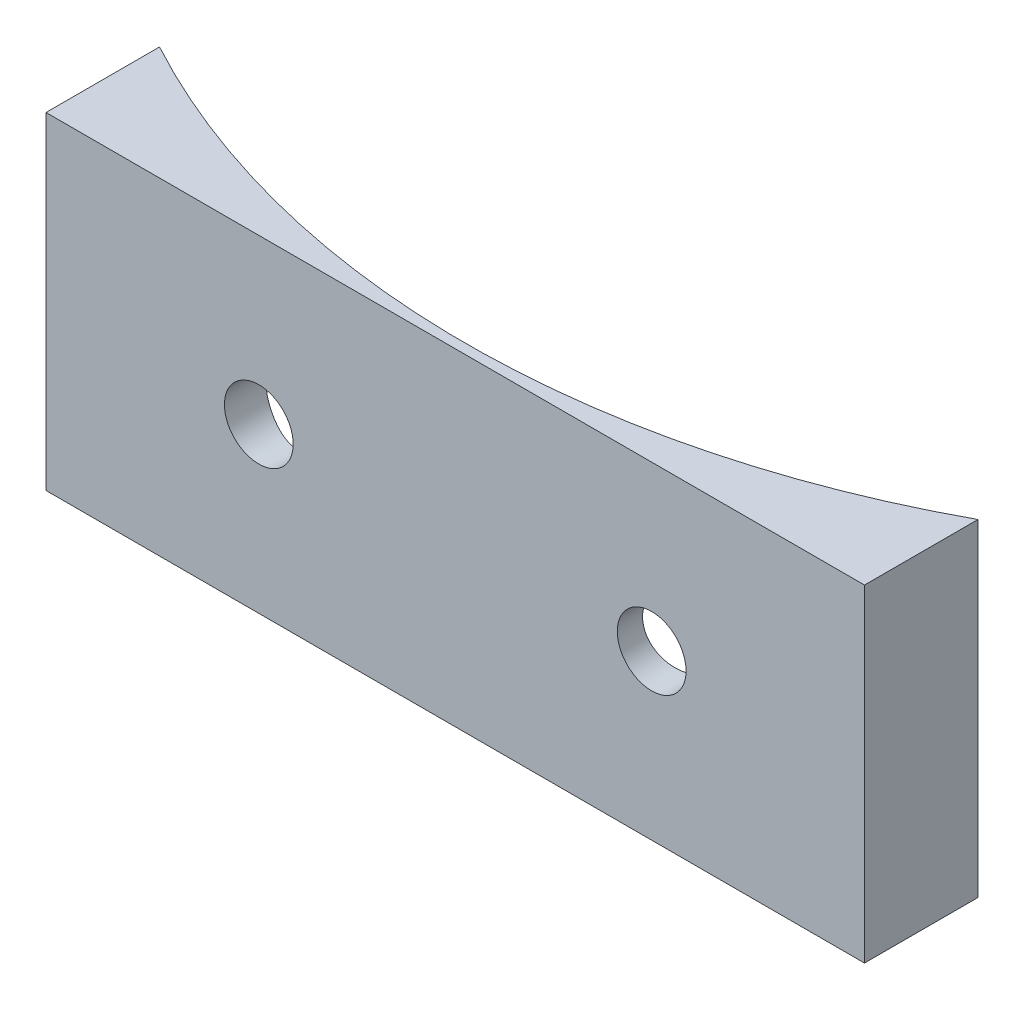
ISO-10303-21;
HEADER;
FILE_DESCRIPTION(('STEP AP214'),'2;1');
FILE_NAME('part.step','',(''),(''),'','','');
FILE_SCHEMA(('AUTOMOTIVE_DESIGN { 1 0 10303 214 1 1 1 1 }'));
ENDSEC;
DATA;
#1=APPLICATION_CONTEXT('core data for automotive mechanical design processes');
#2=APPLICATION_PROTOCOL_DEFINITION('international standard','automotive_design',2000,#1);
#3=PRODUCT_CONTEXT('',#1,'mechanical');
#4=PRODUCT('Part','Part','',(#3));
#5=PRODUCT_RELATED_PRODUCT_CATEGORY('part','',(#4));
#6=PRODUCT_DEFINITION_FORMATION('','',#4);
#7=PRODUCT_DEFINITION_CONTEXT('part definition',#1,'design');
#8=PRODUCT_DEFINITION('design','',#6,#7);
#9=PRODUCT_DEFINITION_SHAPE('','',#8);
#10=(LENGTH_UNIT() NAMED_UNIT(*) SI_UNIT(.MILLI.,.METRE.));
#11=(NAMED_UNIT(*) PLANE_ANGLE_UNIT() SI_UNIT($,.RADIAN.));
#12=(NAMED_UNIT(*) SI_UNIT($,.STERADIAN.) SOLID_ANGLE_UNIT());
#13=UNCERTAINTY_MEASURE_WITH_UNIT(LENGTH_MEASURE(1.E-05),#10,'distance_accuracy_value','');
#14=(GEOMETRIC_REPRESENTATION_CONTEXT(3) GLOBAL_UNCERTAINTY_ASSIGNED_CONTEXT((#13)) GLOBAL_UNIT_ASSIGNED_CONTEXT((#10,
#11,#12)) REPRESENTATION_CONTEXT('',''));
#15=CARTESIAN_POINT('',(0.,0.,0.));
#16=DIRECTION('',(0.,0.,1.));
#17=DIRECTION('',(1.,0.,0.));
#18=AXIS2_PLACEMENT_3D('',#15,#16,#17);
#19=CARTESIAN_POINT('',(0.,20.,0.));
#20=DIRECTION('',(0.,-1.,0.));
#21=DIRECTION('',(0.,0.,-1.));
#22=AXIS2_PLACEMENT_3D('',#19,#20,#21);
#23=CYLINDRICAL_SURFACE('',#22,52.5);
#24=CARTESIAN_POINT('',(-9.89999999999999,10.,51.558122541458));
#25=CARTESIAN_POINT('',(-9.90000537301511,10.1162955837565,51.5581218664655));
#26=CARTESIAN_POINT('',(-9.90969571298099,10.2326757477756,51.5562637349352));
#27=CARTESIAN_POINT('',(-9.94818660097837,10.4622063508252,51.5488501543209));
#28=CARTESIAN_POINT('',(-9.97701005640323,10.5753527486027,51.5432902732408));
#29=CARTESIAN_POINT('',(-10.052845805051,10.7950324296863,51.5285529924344));
#30=CARTESIAN_POINT('',(-10.0998437134278,10.901570865918,51.5193784535556));
#31=CARTESIAN_POINT('',(-10.2105599576293,11.1051376152931,51.4975497802461));
#32=CARTESIAN_POINT('',(-10.2742745043983,11.2021680767129,51.4848964343037));
#33=CARTESIAN_POINT('',(-10.4169854319504,11.3847682979292,51.4562117891395));
#34=CARTESIAN_POINT('',(-10.4960835871258,11.4702549249063,51.4401579260991));
#35=CARTESIAN_POINT('',(-10.6669156926341,11.6267479672698,51.405004631484));
#36=CARTESIAN_POINT('',(-10.75865100365,11.6977528213125,51.3859048719129));
#37=CARTESIAN_POINT('',(-10.953776077393,11.8246063399359,51.3446675619235));
#38=CARTESIAN_POINT('',(-11.0573395087188,11.8801725846973,51.3224833136374));
#39=CARTESIAN_POINT('',(-11.271820610551,11.9731758415379,51.2758042372228));
#40=CARTESIAN_POINT('',(-11.3827390886136,12.010610859118,51.2513091552482));
#41=CARTESIAN_POINT('',(-11.6113213106091,12.0671448766196,51.2000119302403));
#42=CARTESIAN_POINT('',(-11.7290791978693,12.0858283420929,51.1731712575308));
#43=CARTESIAN_POINT('',(-11.9657954718975,12.1030734870097,51.1183382356087));
#44=CARTESIAN_POINT('',(-12.0847539948502,12.1016328576103,51.0903457546163));
#45=CARTESIAN_POINT('',(-12.3228253238946,12.0785446297891,51.0334520435456));
#46=CARTESIAN_POINT('',(-12.4419003796702,12.0565242130957,51.0045435787932));
#47=CARTESIAN_POINT('',(-12.6746266524922,11.992348146797,50.9472100591158));
#48=CARTESIAN_POINT('',(-12.7882775000124,11.9501911275251,50.9187850372102));
#49=CARTESIAN_POINT('',(-13.007458454135,11.8465617875434,50.8632369851716));
#50=CARTESIAN_POINT('',(-13.1129475423988,11.7849989158932,50.8361207604347));
#51=CARTESIAN_POINT('',(-13.3120691764805,11.6441837729633,50.7843421956545));
#52=CARTESIAN_POINT('',(-13.4057024273511,11.5649325543637,50.7596797097091));
#53=CARTESIAN_POINT('',(-13.576758240006,11.39225062343,50.7141928773133));
#54=CARTESIAN_POINT('',(-13.6544199827092,11.2990718690526,50.6933125623251));
#55=CARTESIAN_POINT('',(-13.7928585602786,11.1001510572924,50.655821132026));
#56=CARTESIAN_POINT('',(-13.8536387519148,10.9944115035092,50.6392091680347));
#57=CARTESIAN_POINT('',(-13.9544996129862,10.7770561855631,50.6115065959922));
#58=CARTESIAN_POINT('',(-13.9951903115709,10.6657442239057,50.6002536941381));
#59=CARTESIAN_POINT('',(-14.0573255132255,10.4374853500946,50.5830273157982));
#60=CARTESIAN_POINT('',(-14.0787740122091,10.3205396131914,50.5770527431968));
#61=CARTESIAN_POINT('',(-14.1012933745044,10.0881773122718,50.5707786832448));
#62=CARTESIAN_POINT('',(-14.1029674225807,9.97282337407274,50.5703112126667));
#63=CARTESIAN_POINT('',(-14.0874415843987,9.74350012950838,50.5746384390971));
#64=CARTESIAN_POINT('',(-14.0702431964331,9.62953071395134,50.5794327183727));
#65=CARTESIAN_POINT('',(-14.0178203124686,9.40727781264944,50.593986165166));
#66=CARTESIAN_POINT('',(-13.9827637818387,9.29895153188333,50.6036990654857));
#67=CARTESIAN_POINT('',(-13.8958765800138,9.08979152281291,50.6276271709738));
#68=CARTESIAN_POINT('',(-13.8440448140163,8.98895828405543,50.641842669994));
#69=CARTESIAN_POINT('',(-13.7241892974018,8.79570671974408,50.6744564561203));
#70=CARTESIAN_POINT('',(-13.6559006516073,8.70346438754377,50.6929229243632));
#71=CARTESIAN_POINT('',(-13.5056831611313,8.53168700958706,50.7331504729011));
#72=CARTESIAN_POINT('',(-13.4237521985114,8.45215394067761,50.7549120647089));
#73=CARTESIAN_POINT('',(-13.2456734204099,8.30528835101241,50.8016817379229));
#74=CARTESIAN_POINT('',(-13.1491485313159,8.23843942064955,50.8267726669606));
#75=CARTESIAN_POINT('',(-12.9466953095858,8.12185748756552,50.8787185035338));
#76=CARTESIAN_POINT('',(-12.8407654557981,8.07212725997658,50.9055736962365));
#77=CARTESIAN_POINT('',(-12.6190977328814,7.98974994772109,50.9609830165027));
#78=CARTESIAN_POINT('',(-12.5031625411167,7.95765106060061,50.9895638973806));
#79=CARTESIAN_POINT('',(-12.2675239066538,7.9136636280992,51.0467683226007));
#80=CARTESIAN_POINT('',(-12.1478201167523,7.90177695046415,51.0753918706411));
#81=CARTESIAN_POINT('',(-11.9064861845881,7.89857391222834,51.1321927327086));
#82=CARTESIAN_POINT('',(-11.7848502886045,7.9075088204333,51.1603604222337));
#83=CARTESIAN_POINT('',(-11.544603220574,7.94636438413945,51.2151083139986));
#84=CARTESIAN_POINT('',(-11.4259919854289,7.97628460148927,51.2416885493702));
#85=CARTESIAN_POINT('',(-11.1962378555562,8.05612792772986,51.2923775834042));
#86=CARTESIAN_POINT('',(-11.0850431018642,8.10589018794962,51.3165043435127));
#87=CARTESIAN_POINT('',(-10.8724988040859,8.22418270984194,51.3619566570988));
#88=CARTESIAN_POINT('',(-10.7711478605059,8.29271029834244,51.3832826089193));
#89=CARTESIAN_POINT('',(-10.5834270714783,8.44512289957031,51.4222723600265));
#90=CARTESIAN_POINT('',(-10.4967950304002,8.52866817567253,51.4400016729239));
#91=CARTESIAN_POINT('',(-10.3387836708184,8.70973123004445,51.4719930613794));
#92=CARTESIAN_POINT('',(-10.2674063611027,8.80725084567534,51.4862546803353));
#93=CARTESIAN_POINT('',(-10.1435785368938,9.01124127259799,51.5107923485941));
#94=CARTESIAN_POINT('',(-10.0907613592903,9.1174805471747,51.5211459495922));
#95=CARTESIAN_POINT('',(-10.0037401280032,9.33750118700572,51.5381137511425));
#96=CARTESIAN_POINT('',(-9.96951144311402,9.4512723464077,51.5447329005897));
#97=CARTESIAN_POINT('',(-9.93012336695584,9.63819186585467,51.5523313156704));
#98=CARTESIAN_POINT('',(-9.9188426780539,9.71006045347977,51.5545014473342));
#99=CARTESIAN_POINT('',(-9.90377934717588,9.85460834397091,51.5573972650199));
#100=CARTESIAN_POINT('',(-9.89999664058945,9.92728763984562,51.5581229634886));
#101=CARTESIAN_POINT('',(-9.89999999999999,10.,51.558122541458));
#102=B_SPLINE_CURVE_WITH_KNOTS('',3,(#24,#25,#26,#27,#28,#29,#30,#31,#32,#33,#34,#35,#36,#37,
#38,#39,#40,#41,#42,#43,#44,#45,#46,#47,#48,#49,#50,#51,#52,#53,#54,#55,#56,#57,#58,#59,#60,#61,
#62,#63,#64,#65,#66,#67,#68,#69,#70,#71,#72,#73,#74,#75,#76,#77,#78,#79,#80,#81,#82,#83,#84,#85,
#86,#87,#88,#89,#90,#91,#92,#93,#94,#95,#96,#97,#98,#99,#100,#101),.UNSPECIFIED.,.T.,.F.,(4,2,2,
2,2,2,2,2,2,2,2,2,2,2,2,2,2,2,2,2,2,2,2,2,2,2,2,2,2,2,2,2,2,2,2,2,2,2,4),(0.,0.348619225055304,
0.697656594054003,1.046418268026,1.39510095856637,1.74617414560933,2.09728516341511,
2.45444979829284,2.81165371362864,3.17660922396316,3.54160660608618,3.91334706568871,
4.28511281421371,4.65863962349292,5.03214420913202,5.39956566242702,5.76691400432658,
6.12229075225842,6.47759368410948,6.82202970170927,7.16643837633045,7.50766592065445,
7.84891573901179,8.19607597155065,8.54329015025656,8.90185002230996,9.26046799356522,
9.62968251892969,9.99893116037829,10.3726588213264,10.7463786794631,11.1171286573096,
11.4878258482632,11.8510031716301,12.2142282898301,12.5698102217458,12.9249198229678,
13.1428915142861,13.3608613273277),.UNSPECIFIED.);
#103=CARTESIAN_POINT('',(-9.89999999999999,10.,51.558122541458));
#104=VERTEX_POINT('',#103);
#105=EDGE_CURVE('E116',#104,#104,#102,.T.);
#106=ORIENTED_EDGE('',*,*,#105,.T.);
#107=EDGE_LOOP('',(#106));
#108=FACE_BOUND('',#107,.T.);
#109=CARTESIAN_POINT('',(14.1,9.99999999999999,50.5711380136931));
#110=CARTESIAN_POINT('',(14.0999943881775,10.1148878338749,50.5711399382245));
#111=CARTESIAN_POINT('',(14.0905343317669,10.2298605441136,50.5737801431512));
#112=CARTESIAN_POINT('',(14.052991778189,10.4565733094615,50.5842246723281));
#113=CARTESIAN_POINT('',(14.0248866679766,10.5683092670285,50.5920352672922));
#114=CARTESIAN_POINT('',(13.9510542553686,10.7851654498761,50.6124445222986));
#115=CARTESIAN_POINT('',(13.9053503949743,10.8902942602814,50.6250368126884));
#116=CARTESIAN_POINT('',(13.7978174253102,11.0912576803349,50.6544502156696));
#117=CARTESIAN_POINT('',(13.7359909397006,11.1870937987197,50.671270640194));
#118=CARTESIAN_POINT('',(13.5968901446063,11.3686658764597,50.7087747959451));
#119=CARTESIAN_POINT('',(13.5193665148124,11.4541978383103,50.7295204704539));
#120=CARTESIAN_POINT('',(13.351835246796,11.6111244035409,50.7738711767796));
#121=CARTESIAN_POINT('',(13.2618252747326,11.6825163579207,50.7974767430383));
#122=CARTESIAN_POINT('',(13.0685679245853,11.8116619819341,50.8475447965379));
#123=CARTESIAN_POINT('',(12.9649760288248,11.8688733117826,50.8740768664245));
#124=CARTESIAN_POINT('',(12.749947966488,11.9650588331307,50.9283920816082));
#125=CARTESIAN_POINT('',(12.6385106155529,12.004030264294,50.9561754155685));
#126=CARTESIAN_POINT('',(12.40788632139,12.063531922091,51.0128297210613));
#127=CARTESIAN_POINT('',(12.2885746235281,12.0835704486482,51.041710422989));
#128=CARTESIAN_POINT('',(12.0481626774106,12.102908739207,51.0989926172055));
#129=CARTESIAN_POINT('',(11.9270623323183,12.102207376215,51.1273940833689));
#130=CARTESIAN_POINT('',(11.6857922319593,12.0799115679628,51.1830799640849));
#131=CARTESIAN_POINT('',(11.5656317520861,12.0581977255214,51.2103570659479));
#132=CARTESIAN_POINT('',(11.3304744814896,11.9941372251918,51.262899539576));
#133=CARTESIAN_POINT('',(11.2154774240501,11.9517916343771,51.2881650153038));
#134=CARTESIAN_POINT('',(10.9955654669573,11.8481603281349,51.3357580016628));
#135=CARTESIAN_POINT('',(10.8905402045659,11.7871244114236,51.3581190276204));
#136=CARTESIAN_POINT('',(10.6921821030275,11.6475180094056,51.3997813878667));
#137=CARTESIAN_POINT('',(10.5988479053305,11.568949564408,51.4190830777322));
#138=CARTESIAN_POINT('',(10.4287340869208,11.398328321387,51.453852129967));
#139=CARTESIAN_POINT('',(10.3516396852574,11.3066044513276,51.4693934876731));
#140=CARTESIAN_POINT('',(10.2139655282371,11.1110250594808,51.4968916847979));
#141=CARTESIAN_POINT('',(10.1533838474114,11.0071709541608,51.5088489421575));
#142=CARTESIAN_POINT('',(10.0517506622988,10.7925517157906,51.5287778744878));
#143=CARTESIAN_POINT('',(10.0103289363116,10.681968843021,51.5368252677339));
#144=CARTESIAN_POINT('',(9.94655759188608,10.4552353843056,51.5491712600424));
#145=CARTESIAN_POINT('',(9.92420641228298,10.3390852549323,51.5534701659664));
#146=CARTESIAN_POINT('',(9.89945545043686,10.1061135757853,51.5582286384504));
#147=CARTESIAN_POINT('',(9.89680346261371,9.98931974241229,51.5587367384604));
#148=CARTESIAN_POINT('',(9.91086768050058,9.75695056715335,51.5560350641856));
#149=CARTESIAN_POINT('',(9.92758319985616,9.64137518223398,51.5528254216517));
#150=CARTESIAN_POINT('',(9.97976304799858,9.41512843789912,51.5427494854989));
#151=CARTESIAN_POINT('',(10.0151626688132,9.3044415732021,51.5358958115228));
#152=CARTESIAN_POINT('',(10.1035696003375,9.09064073374027,51.5186364124513));
#153=CARTESIAN_POINT('',(10.1565771323846,8.9875268541903,51.508230642705));
#154=CARTESIAN_POINT('',(10.2789526690314,8.79108783519832,51.4839492628245));
#155=CARTESIAN_POINT('',(10.3484185126808,8.69782625278038,51.470052871187));
#156=CARTESIAN_POINT('',(10.501433392071,8.52430280379146,51.4390510776871));
#157=CARTESIAN_POINT('',(10.5849832845809,8.44404172865785,51.4219454805931));
#158=CARTESIAN_POINT('',(10.765047097209,8.2974825649054,51.3845533608111));
#159=CARTESIAN_POINT('',(10.8617351973094,8.23140966450618,51.3642233509033));
#160=CARTESIAN_POINT('',(11.0642779729353,8.11638844747341,51.3209749323001));
#161=CARTESIAN_POINT('',(11.1701335642737,8.06744184418812,51.2980562649335));
#162=CARTESIAN_POINT('',(11.3903276310163,7.9869613887367,51.2496184795878));
#163=CARTESIAN_POINT('',(11.5047971533779,7.95581281208313,51.2240550259402));
#164=CARTESIAN_POINT('',(11.7369900796631,7.91319294909675,51.1713517373262));
#165=CARTESIAN_POINT('',(11.8547138786193,7.90172406241063,51.1442117105372));
#166=CARTESIAN_POINT('',(12.0926453169676,7.89860514636155,51.0884836149174));
#167=CARTESIAN_POINT('',(12.2128541844535,7.90736809582766,51.0598772361094));
#168=CARTESIAN_POINT('',(12.45000026527,7.94526840683775,51.0025723249003));
#169=CARTESIAN_POINT('',(12.5669371791373,7.97440762700316,50.9738737843305));
#170=CARTESIAN_POINT('',(12.7954742254525,8.0527046742523,50.9169898361204));
#171=CARTESIAN_POINT('',(12.9070069450076,8.10206569738385,50.8888127638251));
#172=CARTESIAN_POINT('',(13.1201978566581,8.21955956745086,50.8342652972322));
#173=CARTESIAN_POINT('',(13.221856522966,8.28769151228809,50.8078948161892));
#174=CARTESIAN_POINT('',(13.4113289592973,8.4402547698745,50.7582089369629));
#175=CARTESIAN_POINT('',(13.4992640568769,8.52452660075909,50.7348671150485));
#176=CARTESIAN_POINT('',(13.6596493873595,8.70757422290603,50.6919213608426));
#177=CARTESIAN_POINT('',(13.7320981435638,8.80635139581022,50.6723177850304));
#178=CARTESIAN_POINT('',(13.8572064158024,9.01261576112127,50.6382457140858));
#179=CARTESIAN_POINT('',(13.9103682053191,9.11977711194026,50.6236475293883));
#180=CARTESIAN_POINT('',(13.9978008606042,9.34197237001726,50.5995420049647));
#181=CARTESIAN_POINT('',(14.0321000834252,9.4569941659545,50.5900270240193));
#182=CARTESIAN_POINT('',(14.0708555646122,9.64408564360554,50.5792569172552));
#183=CARTESIAN_POINT('',(14.0817681906195,9.71478092892734,50.5762183465776));
#184=CARTESIAN_POINT('',(14.0963420834449,9.8569731863336,50.5721583156695));
#185=CARTESIAN_POINT('',(14.1000034939545,9.92847014250374,50.5711368154683));
#186=CARTESIAN_POINT('',(14.1,9.99999999999999,50.5711380136931));
#187=B_SPLINE_CURVE_WITH_KNOTS('',3,(#109,#110,#111,#112,#113,#114,#115,#116,#117,#118,#119,
#120,#121,#122,#123,#124,#125,#126,#127,#128,#129,#130,#131,#132,#133,#134,#135,#136,#137,#138,
#139,#140,#141,#142,#143,#144,#145,#146,#147,#148,#149,#150,#151,#152,#153,#154,#155,#156,#157,
#158,#159,#160,#161,#162,#163,#164,#165,#166,#167,#168,#169,#170,#171,#172,#173,#174,#175,#176,
#177,#178,#179,#180,#181,#182,#183,#184,#185,#186),.UNSPECIFIED.,.T.,.F.,(4,2,2,2,2,2,2,2,2,2,2,
2,2,2,2,2,2,2,2,2,2,2,2,2,2,2,2,2,2,2,2,2,2,2,2,2,2,2,4),(0.,0.34439671967769,0.689211895159084,
1.03356934773271,1.37787079740833,1.72814359260436,2.0784819462459,2.44065803121023,
2.80288890841007,3.17428764049266,3.54570655420341,3.91924841374218,4.29277095575437,
4.66150444041395,5.03019503688791,5.39089988124457,5.75156264753897,6.10493090688245,
6.45827023580164,6.80707789219098,7.15587318775595,7.50346836377817,7.8510679093534,
8.20078809037772,8.55052955347007,8.90546764033296,9.26044122575039,9.62283318717247,
9.98526933378716,10.3551688684475,10.725102147894,11.0988475647423,11.4725750231606,
11.8427841787481,12.2130286198619,12.5727889722484,12.9320069897779,13.146434711406,
13.3608581838473),.UNSPECIFIED.);
#188=CARTESIAN_POINT('',(14.1,9.99999999999999,50.5711380136931));
#189=VERTEX_POINT('',#188);
#190=EDGE_CURVE('E140',#189,#189,#187,.T.);
#191=ORIENTED_EDGE('',*,*,#190,.T.);
#192=EDGE_LOOP('',(#191));
#193=FACE_BOUND('',#192,.T.);
#194=CARTESIAN_POINT('',(0.,0.,0.));
#195=DIRECTION('',(0.,-1.,0.));
#196=DIRECTION('',(0.,0.,1.));
#197=AXIS2_PLACEMENT_3D('',#194,#195,#196);
#198=CIRCLE('',#197,52.5);
#199=CARTESIAN_POINT('',(25.,0.,46.1654632815485));
#200=VERTEX_POINT('',#199);
#201=CARTESIAN_POINT('',(-25.,0.,46.1654632815485));
#202=VERTEX_POINT('',#201);
#203=EDGE_CURVE('E112',#200,#202,#198,.T.);
#204=ORIENTED_EDGE('',*,*,#203,.T.);
#205=DIRECTION('',(0.,-1.,0.));
#206=VECTOR('',#205,1.);
#207=CARTESIAN_POINT('',(-25.,20.,46.1654632815485));
#208=LINE('',#207,#206);
#209=CARTESIAN_POINT('',(-25.,20.,46.1654632815485));
#210=VERTEX_POINT('',#209);
#211=EDGE_CURVE('E11',#210,#202,#208,.T.);
#212=ORIENTED_EDGE('',*,*,#211,.F.);
#213=CARTESIAN_POINT('',(0.,20.,0.));
#214=DIRECTION('',(0.,-1.,0.));
#215=DIRECTION('',(0.,0.,1.));
#216=AXIS2_PLACEMENT_3D('',#213,#214,#215);
#217=CIRCLE('',#216,52.5);
#218=CARTESIAN_POINT('',(25.,20.,46.1654632815485));
#219=VERTEX_POINT('',#218);
#220=EDGE_CURVE('E96',#219,#210,#217,.T.);
#221=ORIENTED_EDGE('',*,*,#220,.F.);
#222=DIRECTION('',(0.,-1.,0.));
#223=VECTOR('',#222,1.);
#224=CARTESIAN_POINT('',(25.,20.,46.1654632815485));
#225=LINE('',#224,#223);
#226=EDGE_CURVE('E108',#219,#200,#225,.T.);
#227=ORIENTED_EDGE('',*,*,#226,.T.);
#228=EDGE_LOOP('',(#204,#212,#221,#227));
#229=FACE_BOUND('',#228,.T.);
#230=ADVANCED_FACE('F43',(#108,#193,#229),#23,.F.);
#231=CARTESIAN_POINT('',(-25.,20.,46.1654632815485));
#232=DIRECTION('',(1.,0.,0.));
#233=DIRECTION('',(0.,0.,-1.));
#234=AXIS2_PLACEMENT_3D('',#231,#232,#233);
#235=PLANE('',#234);
#236=DIRECTION('',(0.,0.,1.));
#237=VECTOR('',#236,1.);
#238=CARTESIAN_POINT('',(-25.,0.,46.1654632815485));
#239=LINE('',#238,#237);
#240=CARTESIAN_POINT('',(-25.,0.,53.1));
#241=VERTEX_POINT('',#240);
#242=EDGE_CURVE('E101',#202,#241,#239,.T.);
#243=ORIENTED_EDGE('',*,*,#242,.T.);
#244=DIRECTION('',(0.,-1.,0.));
#245=VECTOR('',#244,1.);
#246=CARTESIAN_POINT('',(-25.,20.,53.1));
#247=LINE('',#246,#245);
#248=CARTESIAN_POINT('',(-25.,20.,53.1));
#249=VERTEX_POINT('',#248);
#250=EDGE_CURVE('E53',#249,#241,#247,.T.);
#251=ORIENTED_EDGE('',*,*,#250,.F.);
#252=DIRECTION('',(0.,0.,1.));
#253=VECTOR('',#252,1.);
#254=CARTESIAN_POINT('',(-25.,20.,46.1654632815485));
#255=LINE('',#254,#253);
#256=EDGE_CURVE('E91',#210,#249,#255,.T.);
#257=ORIENTED_EDGE('',*,*,#256,.F.);
#258=ORIENTED_EDGE('',*,*,#211,.T.);
#259=EDGE_LOOP('',(#243,#251,#257,#258));
#260=FACE_BOUND('',#259,.T.);
#261=ADVANCED_FACE('F100',(#260),#235,.F.);
#262=CARTESIAN_POINT('',(-25.,20.,53.1));
#263=DIRECTION('',(0.,0.,-1.));
#264=DIRECTION('',(-1.,0.,0.));
#265=AXIS2_PLACEMENT_3D('',#262,#263,#264);
#266=PLANE('',#265);
#267=CARTESIAN_POINT('',(-12.,10.,53.1));
#268=DIRECTION('',(0.,0.,1.));
#269=DIRECTION('',(1.,0.,0.));
#270=AXIS2_PLACEMENT_3D('',#267,#268,#269);
#271=CIRCLE('',#270,2.1);
#272=CARTESIAN_POINT('',(-9.89999999999999,10.,53.1));
#273=VERTEX_POINT('',#272);
#274=EDGE_CURVE('E176',#273,#273,#271,.T.);
#275=ORIENTED_EDGE('',*,*,#274,.F.);
#276=EDGE_LOOP('',(#275));
#277=FACE_BOUND('',#276,.T.);
#278=CARTESIAN_POINT('',(12.,9.99999999999999,53.1));
#279=DIRECTION('',(0.,0.,1.));
#280=DIRECTION('',(-1.,0.,0.));
#281=AXIS2_PLACEMENT_3D('',#278,#279,#280);
#282=CIRCLE('',#281,2.1);
#283=CARTESIAN_POINT('',(9.9,9.99999999999999,53.1));
#284=VERTEX_POINT('',#283);
#285=EDGE_CURVE('E179',#284,#284,#282,.T.);
#286=ORIENTED_EDGE('',*,*,#285,.F.);
#287=EDGE_LOOP('',(#286));
#288=FACE_BOUND('',#287,.T.);
#289=DIRECTION('',(1.,0.,0.));
#290=VECTOR('',#289,1.);
#291=CARTESIAN_POINT('',(-25.,0.,53.1));
#292=LINE('',#291,#290);
#293=CARTESIAN_POINT('',(25.,0.,53.1));
#294=VERTEX_POINT('',#293);
#295=EDGE_CURVE('E78',#241,#294,#292,.T.);
#296=ORIENTED_EDGE('',*,*,#295,.T.);
#297=DIRECTION('',(0.,-1.,0.));
#298=VECTOR('',#297,1.);
#299=CARTESIAN_POINT('',(25.,20.,53.1));
#300=LINE('',#299,#298);
#301=CARTESIAN_POINT('',(25.,20.,53.1));
#302=VERTEX_POINT('',#301);
#303=EDGE_CURVE('E103',#302,#294,#300,.T.);
#304=ORIENTED_EDGE('',*,*,#303,.F.);
#305=DIRECTION('',(1.,0.,0.));
#306=VECTOR('',#305,1.);
#307=CARTESIAN_POINT('',(-25.,20.,53.1));
#308=LINE('',#307,#306);
#309=EDGE_CURVE('E94',#249,#302,#308,.T.);
#310=ORIENTED_EDGE('',*,*,#309,.F.);
#311=ORIENTED_EDGE('',*,*,#250,.T.);
#312=EDGE_LOOP('',(#296,#304,#310,#311));
#313=FACE_BOUND('',#312,.T.);
#314=ADVANCED_FACE('F104',(#277,#288,#313),#266,.F.);
#315=CARTESIAN_POINT('',(25.,20.,53.1));
#316=DIRECTION('',(-1.,0.,0.));
#317=DIRECTION('',(0.,0.,1.));
#318=AXIS2_PLACEMENT_3D('',#315,#316,#317);
#319=PLANE('',#318);
#320=DIRECTION('',(0.,0.,-1.));
#321=VECTOR('',#320,1.);
#322=CARTESIAN_POINT('',(25.,0.,53.1));
#323=LINE('',#322,#321);
#324=EDGE_CURVE('E84',#294,#200,#323,.T.);
#325=ORIENTED_EDGE('',*,*,#324,.T.);
#326=ORIENTED_EDGE('',*,*,#226,.F.);
#327=DIRECTION('',(0.,0.,-1.));
#328=VECTOR('',#327,1.);
#329=CARTESIAN_POINT('',(25.,20.,53.1));
#330=LINE('',#329,#328);
#331=EDGE_CURVE('E61',#302,#219,#330,.T.);
#332=ORIENTED_EDGE('',*,*,#331,.F.);
#333=ORIENTED_EDGE('',*,*,#303,.T.);
#334=EDGE_LOOP('',(#325,#326,#332,#333));
#335=FACE_BOUND('',#334,.T.);
#336=ADVANCED_FACE('F126',(#335),#319,.F.);
#337=CARTESIAN_POINT('',(0.,20.,0.));
#338=DIRECTION('',(0.,1.,0.));
#339=DIRECTION('',(0.,0.,1.));
#340=AXIS2_PLACEMENT_3D('',#337,#338,#339);
#341=PLANE('',#340);
#342=ORIENTED_EDGE('',*,*,#220,.T.);
#343=ORIENTED_EDGE('',*,*,#256,.T.);
#344=ORIENTED_EDGE('',*,*,#309,.T.);
#345=ORIENTED_EDGE('',*,*,#331,.T.);
#346=EDGE_LOOP('',(#342,#343,#344,#345));
#347=FACE_BOUND('',#346,.T.);
#348=ADVANCED_FACE('F92',(#347),#341,.T.);
#349=CARTESIAN_POINT('',(0.,0.,0.));
#350=DIRECTION('',(0.,1.,0.));
#351=DIRECTION('',(0.,0.,1.));
#352=AXIS2_PLACEMENT_3D('',#349,#350,#351);
#353=PLANE('',#352);
#354=ORIENTED_EDGE('',*,*,#203,.F.);
#355=ORIENTED_EDGE('',*,*,#324,.F.);
#356=ORIENTED_EDGE('',*,*,#295,.F.);
#357=ORIENTED_EDGE('',*,*,#242,.F.);
#358=EDGE_LOOP('',(#354,#355,#356,#357));
#359=FACE_BOUND('',#358,.T.);
#360=ADVANCED_FACE('F129',(#359),#353,.F.);
#361=CARTESIAN_POINT('',(12.,9.99999999999999,33.1));
#362=DIRECTION('',(0.,0.,1.));
#363=DIRECTION('',(1.,0.,0.));
#364=AXIS2_PLACEMENT_3D('',#361,#362,#363);
#365=CYLINDRICAL_SURFACE('',#364,2.1);
#366=ORIENTED_EDGE('',*,*,#285,.T.);
#367=EDGE_LOOP('',(#366));
#368=FACE_BOUND('',#367,.T.);
#369=ORIENTED_EDGE('',*,*,#190,.F.);
#370=EDGE_LOOP('',(#369));
#371=FACE_BOUND('',#370,.T.);
#372=ADVANCED_FACE('F149',(#368,#371),#365,.F.);
#373=CARTESIAN_POINT('',(-12.,10.,33.1));
#374=DIRECTION('',(0.,0.,1.));
#375=DIRECTION('',(1.,0.,0.));
#376=AXIS2_PLACEMENT_3D('',#373,#374,#375);
#377=CYLINDRICAL_SURFACE('',#376,2.1);
#378=ORIENTED_EDGE('',*,*,#274,.T.);
#379=EDGE_LOOP('',(#378));
#380=FACE_BOUND('',#379,.T.);
#381=ORIENTED_EDGE('',*,*,#105,.F.);
#382=EDGE_LOOP('',(#381));
#383=FACE_BOUND('',#382,.T.);
#384=ADVANCED_FACE('F146',(#380,#383),#377,.F.);
#385=CLOSED_SHELL('',(#230,#261,#314,#336,#348,#360,#372,#384));
#386=MANIFOLD_SOLID_BREP('B2',#385);
#387=ADVANCED_BREP_SHAPE_REPRESENTATION('',(#18,#386),#14);
#388=SHAPE_DEFINITION_REPRESENTATION(#9,#387);
ENDSEC;
END-ISO-10303-21;
